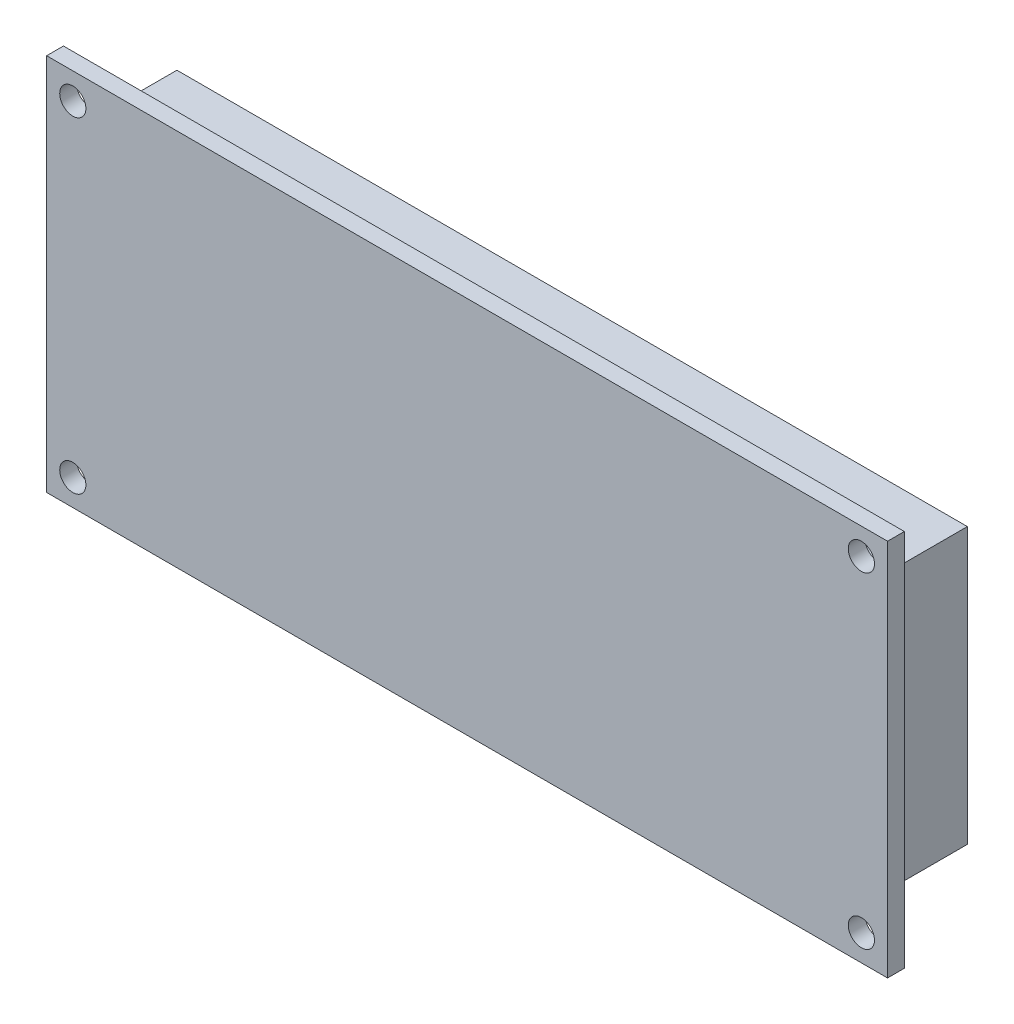
ISO-10303-21;
HEADER;
FILE_DESCRIPTION(('STEP AP214'),'2;1');
FILE_NAME('part.step','',(''),(''),'','','');
FILE_SCHEMA(('AUTOMOTIVE_DESIGN { 1 0 10303 214 1 1 1 1 }'));
ENDSEC;
DATA;
#1=APPLICATION_CONTEXT('core data for automotive mechanical design processes');
#2=APPLICATION_PROTOCOL_DEFINITION('international standard','automotive_design',2000,#1);
#3=PRODUCT_CONTEXT('',#1,'mechanical');
#4=PRODUCT('Part','Part','',(#3));
#5=PRODUCT_RELATED_PRODUCT_CATEGORY('part','',(#4));
#6=PRODUCT_DEFINITION_FORMATION('','',#4);
#7=PRODUCT_DEFINITION_CONTEXT('part definition',#1,'design');
#8=PRODUCT_DEFINITION('design','',#6,#7);
#9=PRODUCT_DEFINITION_SHAPE('','',#8);
#10=(LENGTH_UNIT() NAMED_UNIT(*) SI_UNIT(.MILLI.,.METRE.));
#11=(NAMED_UNIT(*) PLANE_ANGLE_UNIT() SI_UNIT($,.RADIAN.));
#12=(NAMED_UNIT(*) SI_UNIT($,.STERADIAN.) SOLID_ANGLE_UNIT());
#13=UNCERTAINTY_MEASURE_WITH_UNIT(LENGTH_MEASURE(1.E-05),#10,'distance_accuracy_value','');
#14=(GEOMETRIC_REPRESENTATION_CONTEXT(3) GLOBAL_UNCERTAINTY_ASSIGNED_CONTEXT((#13)) GLOBAL_UNIT_ASSIGNED_CONTEXT((#10,
#11,#12)) REPRESENTATION_CONTEXT('',''));
#15=CARTESIAN_POINT('',(0.,0.,0.));
#16=DIRECTION('',(0.,0.,1.));
#17=DIRECTION('',(1.,0.,0.));
#18=AXIS2_PLACEMENT_3D('',#15,#16,#17);
#19=CARTESIAN_POINT('',(0.,35.9918,0.));
#20=DIRECTION('',(0.,0.,-1.));
#21=DIRECTION('',(-1.,0.,0.));
#22=AXIS2_PLACEMENT_3D('',#19,#20,#21);
#23=PLANE('',#22);
#24=CARTESIAN_POINT('',(2.4892,2.4892,0.));
#25=DIRECTION('',(0.,0.,-1.));
#26=DIRECTION('',(-1.,0.,0.));
#27=AXIS2_PLACEMENT_3D('',#24,#25,#26);
#28=CIRCLE('',#27,1.2446);
#29=CARTESIAN_POINT('',(1.2446,2.4892,0.));
#30=VERTEX_POINT('',#29);
#31=EDGE_CURVE('E238',#30,#30,#28,.T.);
#32=ORIENTED_EDGE('',*,*,#31,.F.);
#33=EDGE_LOOP('',(#32));
#34=FACE_BOUND('',#33,.T.);
#35=CARTESIAN_POINT('',(2.4892,33.5026,0.));
#36=DIRECTION('',(0.,0.,-1.));
#37=DIRECTION('',(-1.,0.,0.));
#38=AXIS2_PLACEMENT_3D('',#35,#36,#37);
#39=CIRCLE('',#38,1.2446);
#40=CARTESIAN_POINT('',(1.2446,33.5026,0.));
#41=VERTEX_POINT('',#40);
#42=EDGE_CURVE('E229',#41,#41,#39,.T.);
#43=ORIENTED_EDGE('',*,*,#42,.F.);
#44=EDGE_LOOP('',(#43));
#45=FACE_BOUND('',#44,.T.);
#46=CARTESIAN_POINT('',(77.5208,33.5026,0.));
#47=DIRECTION('',(0.,0.,-1.));
#48=DIRECTION('',(-1.,0.,0.));
#49=AXIS2_PLACEMENT_3D('',#46,#47,#48);
#50=CIRCLE('',#49,1.2446);
#51=CARTESIAN_POINT('',(76.2762,33.5026,0.));
#52=VERTEX_POINT('',#51);
#53=EDGE_CURVE('E226',#52,#52,#50,.T.);
#54=ORIENTED_EDGE('',*,*,#53,.F.);
#55=EDGE_LOOP('',(#54));
#56=FACE_BOUND('',#55,.T.);
#57=CARTESIAN_POINT('',(77.5208,2.4892,0.));
#58=DIRECTION('',(0.,0.,-1.));
#59=DIRECTION('',(-1.,0.,0.));
#60=AXIS2_PLACEMENT_3D('',#57,#58,#59);
#61=CIRCLE('',#60,1.2446);
#62=CARTESIAN_POINT('',(76.2762,2.4892,0.));
#63=VERTEX_POINT('',#62);
#64=EDGE_CURVE('E149',#63,#63,#61,.T.);
#65=ORIENTED_EDGE('',*,*,#64,.F.);
#66=EDGE_LOOP('',(#65));
#67=FACE_BOUND('',#66,.T.);
#68=DIRECTION('',(0.,1.,0.));
#69=VECTOR('',#68,1.);
#70=CARTESIAN_POINT('',(0.,0.,0.));
#71=LINE('',#70,#69);
#72=CARTESIAN_POINT('',(0.,0.,0.));
#73=VERTEX_POINT('',#72);
#74=CARTESIAN_POINT('',(0.,35.9918,0.));
#75=VERTEX_POINT('',#74);
#76=EDGE_CURVE('E195',#73,#75,#71,.T.);
#77=ORIENTED_EDGE('',*,*,#76,.T.);
#78=DIRECTION('',(1.,0.,0.));
#79=VECTOR('',#78,1.);
#80=CARTESIAN_POINT('',(0.,35.9918,0.));
#81=LINE('',#80,#79);
#82=CARTESIAN_POINT('',(80.01,35.9918,0.));
#83=VERTEX_POINT('',#82);
#84=EDGE_CURVE('E210',#75,#83,#81,.T.);
#85=ORIENTED_EDGE('',*,*,#84,.T.);
#86=DIRECTION('',(0.,1.,0.));
#87=VECTOR('',#86,1.);
#88=CARTESIAN_POINT('',(80.01,0.,0.));
#89=LINE('',#88,#87);
#90=CARTESIAN_POINT('',(80.01,0.,0.));
#91=VERTEX_POINT('',#90);
#92=EDGE_CURVE('E213',#91,#83,#89,.T.);
#93=ORIENTED_EDGE('',*,*,#92,.F.);
#94=DIRECTION('',(1.,0.,0.));
#95=VECTOR('',#94,1.);
#96=CARTESIAN_POINT('',(0.,0.,0.));
#97=LINE('',#96,#95);
#98=EDGE_CURVE('E200',#73,#91,#97,.T.);
#99=ORIENTED_EDGE('',*,*,#98,.F.);
#100=EDGE_LOOP('',(#77,#85,#93,#99));
#101=FACE_BOUND('',#100,.T.);
#102=DIRECTION('',(1.,0.,0.));
#103=VECTOR('',#102,1.);
#104=CARTESIAN_POINT('',(2.4892,31.0896,0.));
#105=LINE('',#104,#103);
#106=CARTESIAN_POINT('',(2.4892,31.0896,0.));
#107=VERTEX_POINT('',#106);
#108=CARTESIAN_POINT('',(77.6986,31.0896,0.));
#109=VERTEX_POINT('',#108);
#110=EDGE_CURVE('E59',#107,#109,#105,.T.);
#111=ORIENTED_EDGE('',*,*,#110,.F.);
#112=DIRECTION('',(0.,1.,0.));
#113=VECTOR('',#112,1.);
#114=CARTESIAN_POINT('',(2.4892,4.9022,0.));
#115=LINE('',#114,#113);
#116=CARTESIAN_POINT('',(2.4892,4.9022,0.));
#117=VERTEX_POINT('',#116);
#118=EDGE_CURVE('E162',#117,#107,#115,.T.);
#119=ORIENTED_EDGE('',*,*,#118,.F.);
#120=DIRECTION('',(1.,0.,0.));
#121=VECTOR('',#120,1.);
#122=CARTESIAN_POINT('',(2.4892,4.9022,0.));
#123=LINE('',#122,#121);
#124=CARTESIAN_POINT('',(77.6986,4.9022,0.));
#125=VERTEX_POINT('',#124);
#126=EDGE_CURVE('E170',#117,#125,#123,.T.);
#127=ORIENTED_EDGE('',*,*,#126,.T.);
#128=DIRECTION('',(0.,1.,0.));
#129=VECTOR('',#128,1.);
#130=CARTESIAN_POINT('',(77.6986,4.9022,0.));
#131=LINE('',#130,#129);
#132=EDGE_CURVE('E182',#125,#109,#131,.T.);
#133=ORIENTED_EDGE('',*,*,#132,.T.);
#134=EDGE_LOOP('',(#111,#119,#127,#133));
#135=FACE_BOUND('',#134,.T.);
#136=ADVANCED_FACE('F34',(#34,#45,#56,#67,#101,#135),#23,.T.);
#137=CARTESIAN_POINT('',(0.,0.,1.6002));
#138=DIRECTION('',(-1.,0.,0.));
#139=DIRECTION('',(0.,0.,1.));
#140=AXIS2_PLACEMENT_3D('',#137,#138,#139);
#141=PLANE('',#140);
#142=ORIENTED_EDGE('',*,*,#76,.F.);
#143=DIRECTION('',(0.,0.,-1.));
#144=VECTOR('',#143,1.);
#145=CARTESIAN_POINT('',(0.,0.,1.6002));
#146=LINE('',#145,#144);
#147=CARTESIAN_POINT('',(0.,0.,1.6002));
#148=VERTEX_POINT('',#147);
#149=EDGE_CURVE('E11',#148,#73,#146,.T.);
#150=ORIENTED_EDGE('',*,*,#149,.F.);
#151=DIRECTION('',(0.,1.,0.));
#152=VECTOR('',#151,1.);
#153=CARTESIAN_POINT('',(0.,0.,1.6002));
#154=LINE('',#153,#152);
#155=CARTESIAN_POINT('',(0.,35.9918,1.6002));
#156=VERTEX_POINT('',#155);
#157=EDGE_CURVE('E196',#148,#156,#154,.T.);
#158=ORIENTED_EDGE('',*,*,#157,.T.);
#159=DIRECTION('',(0.,0.,-1.));
#160=VECTOR('',#159,1.);
#161=CARTESIAN_POINT('',(0.,35.9918,1.6002));
#162=LINE('',#161,#160);
#163=EDGE_CURVE('E207',#156,#75,#162,.T.);
#164=ORIENTED_EDGE('',*,*,#163,.T.);
#165=EDGE_LOOP('',(#142,#150,#158,#164));
#166=FACE_BOUND('',#165,.T.);
#167=ADVANCED_FACE('F36',(#166),#141,.T.);
#168=CARTESIAN_POINT('',(0.,0.,1.6002));
#169=DIRECTION('',(0.,1.,0.));
#170=DIRECTION('',(0.,0.,1.));
#171=AXIS2_PLACEMENT_3D('',#168,#169,#170);
#172=PLANE('',#171);
#173=ORIENTED_EDGE('',*,*,#98,.T.);
#174=DIRECTION('',(0.,0.,-1.));
#175=VECTOR('',#174,1.);
#176=CARTESIAN_POINT('',(80.01,0.,1.6002));
#177=LINE('',#176,#175);
#178=CARTESIAN_POINT('',(80.01,0.,1.6002));
#179=VERTEX_POINT('',#178);
#180=EDGE_CURVE('E43',#179,#91,#177,.T.);
#181=ORIENTED_EDGE('',*,*,#180,.F.);
#182=DIRECTION('',(1.,0.,0.));
#183=VECTOR('',#182,1.);
#184=CARTESIAN_POINT('',(0.,0.,1.6002));
#185=LINE('',#184,#183);
#186=EDGE_CURVE('E205',#148,#179,#185,.T.);
#187=ORIENTED_EDGE('',*,*,#186,.F.);
#188=ORIENTED_EDGE('',*,*,#149,.T.);
#189=EDGE_LOOP('',(#173,#181,#187,#188));
#190=FACE_BOUND('',#189,.T.);
#191=ADVANCED_FACE('F271',(#190),#172,.F.);
#192=CARTESIAN_POINT('',(80.01,0.,1.6002));
#193=DIRECTION('',(-1.,0.,0.));
#194=DIRECTION('',(0.,0.,1.));
#195=AXIS2_PLACEMENT_3D('',#192,#193,#194);
#196=PLANE('',#195);
#197=ORIENTED_EDGE('',*,*,#92,.T.);
#198=DIRECTION('',(0.,0.,-1.));
#199=VECTOR('',#198,1.);
#200=CARTESIAN_POINT('',(80.01,35.9918,1.6002));
#201=LINE('',#200,#199);
#202=CARTESIAN_POINT('',(80.01,35.9918,1.6002));
#203=VERTEX_POINT('',#202);
#204=EDGE_CURVE('E219',#203,#83,#201,.T.);
#205=ORIENTED_EDGE('',*,*,#204,.F.);
#206=DIRECTION('',(0.,1.,0.));
#207=VECTOR('',#206,1.);
#208=CARTESIAN_POINT('',(80.01,0.,1.6002));
#209=LINE('',#208,#207);
#210=EDGE_CURVE('E203',#179,#203,#209,.T.);
#211=ORIENTED_EDGE('',*,*,#210,.F.);
#212=ORIENTED_EDGE('',*,*,#180,.T.);
#213=EDGE_LOOP('',(#197,#205,#211,#212));
#214=FACE_BOUND('',#213,.T.);
#215=ADVANCED_FACE('F268',(#214),#196,.F.);
#216=CARTESIAN_POINT('',(0.,35.9918,1.6002));
#217=DIRECTION('',(0.,1.,0.));
#218=DIRECTION('',(0.,0.,1.));
#219=AXIS2_PLACEMENT_3D('',#216,#217,#218);
#220=PLANE('',#219);
#221=ORIENTED_EDGE('',*,*,#84,.F.);
#222=ORIENTED_EDGE('',*,*,#163,.F.);
#223=DIRECTION('',(1.,0.,0.));
#224=VECTOR('',#223,1.);
#225=CARTESIAN_POINT('',(0.,35.9918,1.6002));
#226=LINE('',#225,#224);
#227=EDGE_CURVE('E199',#156,#203,#226,.T.);
#228=ORIENTED_EDGE('',*,*,#227,.T.);
#229=ORIENTED_EDGE('',*,*,#204,.T.);
#230=EDGE_LOOP('',(#221,#222,#228,#229));
#231=FACE_BOUND('',#230,.T.);
#232=ADVANCED_FACE('F264',(#231),#220,.T.);
#233=CARTESIAN_POINT('',(0.,35.9918,1.6002));
#234=DIRECTION('',(0.,0.,-1.));
#235=DIRECTION('',(-1.,0.,0.));
#236=AXIS2_PLACEMENT_3D('',#233,#234,#235);
#237=PLANE('',#236);
#238=CARTESIAN_POINT('',(2.4892,2.4892,1.6002));
#239=DIRECTION('',(0.,0.,-1.));
#240=DIRECTION('',(-1.,0.,0.));
#241=AXIS2_PLACEMENT_3D('',#238,#239,#240);
#242=CIRCLE('',#241,1.2446);
#243=CARTESIAN_POINT('',(1.2446,2.4892,1.6002));
#244=VERTEX_POINT('',#243);
#245=EDGE_CURVE('E38',#244,#244,#242,.T.);
#246=ORIENTED_EDGE('',*,*,#245,.T.);
#247=EDGE_LOOP('',(#246));
#248=FACE_BOUND('',#247,.T.);
#249=CARTESIAN_POINT('',(2.4892,33.5026,1.6002));
#250=DIRECTION('',(0.,0.,-1.));
#251=DIRECTION('',(-1.,0.,0.));
#252=AXIS2_PLACEMENT_3D('',#249,#250,#251);
#253=CIRCLE('',#252,1.2446);
#254=CARTESIAN_POINT('',(1.2446,33.5026,1.6002));
#255=VERTEX_POINT('',#254);
#256=EDGE_CURVE('E227',#255,#255,#253,.T.);
#257=ORIENTED_EDGE('',*,*,#256,.T.);
#258=EDGE_LOOP('',(#257));
#259=FACE_BOUND('',#258,.T.);
#260=CARTESIAN_POINT('',(77.5208,33.5026,1.6002));
#261=DIRECTION('',(0.,0.,-1.));
#262=DIRECTION('',(-1.,0.,0.));
#263=AXIS2_PLACEMENT_3D('',#260,#261,#262);
#264=CIRCLE('',#263,1.2446);
#265=CARTESIAN_POINT('',(76.2762,33.5026,1.6002));
#266=VERTEX_POINT('',#265);
#267=EDGE_CURVE('E224',#266,#266,#264,.T.);
#268=ORIENTED_EDGE('',*,*,#267,.T.);
#269=EDGE_LOOP('',(#268));
#270=FACE_BOUND('',#269,.T.);
#271=CARTESIAN_POINT('',(77.5208,2.4892,1.6002));
#272=DIRECTION('',(0.,0.,-1.));
#273=DIRECTION('',(-1.,0.,0.));
#274=AXIS2_PLACEMENT_3D('',#271,#272,#273);
#275=CIRCLE('',#274,1.2446);
#276=CARTESIAN_POINT('',(76.2762,2.4892,1.6002));
#277=VERTEX_POINT('',#276);
#278=EDGE_CURVE('E156',#277,#277,#275,.T.);
#279=ORIENTED_EDGE('',*,*,#278,.T.);
#280=EDGE_LOOP('',(#279));
#281=FACE_BOUND('',#280,.T.);
#282=ORIENTED_EDGE('',*,*,#157,.F.);
#283=ORIENTED_EDGE('',*,*,#186,.T.);
#284=ORIENTED_EDGE('',*,*,#210,.T.);
#285=ORIENTED_EDGE('',*,*,#227,.F.);
#286=EDGE_LOOP('',(#282,#283,#284,#285));
#287=FACE_BOUND('',#286,.T.);
#288=ADVANCED_FACE('F273',(#248,#259,#270,#281,#287),#237,.F.);
#289=CARTESIAN_POINT('',(2.4892,4.9022,-8.3058));
#290=DIRECTION('',(1.,0.,0.));
#291=DIRECTION('',(0.,1.,0.));
#292=AXIS2_PLACEMENT_3D('',#289,#290,#291);
#293=PLANE('',#292);
#294=ORIENTED_EDGE('',*,*,#118,.T.);
#295=DIRECTION('',(0.,0.,1.));
#296=VECTOR('',#295,1.);
#297=CARTESIAN_POINT('',(2.4892,31.0896,-8.3058));
#298=LINE('',#297,#296);
#299=CARTESIAN_POINT('',(2.4892,31.0896,-8.3058));
#300=VERTEX_POINT('',#299);
#301=EDGE_CURVE('E193',#300,#107,#298,.T.);
#302=ORIENTED_EDGE('',*,*,#301,.F.);
#303=DIRECTION('',(0.,1.,0.));
#304=VECTOR('',#303,1.);
#305=CARTESIAN_POINT('',(2.4892,4.9022,-8.3058));
#306=LINE('',#305,#304);
#307=CARTESIAN_POINT('',(2.4892,4.9022,-8.3058));
#308=VERTEX_POINT('',#307);
#309=EDGE_CURVE('E166',#308,#300,#306,.T.);
#310=ORIENTED_EDGE('',*,*,#309,.F.);
#311=DIRECTION('',(0.,0.,1.));
#312=VECTOR('',#311,1.);
#313=CARTESIAN_POINT('',(2.4892,4.9022,-8.3058));
#314=LINE('',#313,#312);
#315=EDGE_CURVE('E178',#308,#117,#314,.T.);
#316=ORIENTED_EDGE('',*,*,#315,.T.);
#317=EDGE_LOOP('',(#294,#302,#310,#316));
#318=FACE_BOUND('',#317,.T.);
#319=ADVANCED_FACE('F275',(#318),#293,.F.);
#320=CARTESIAN_POINT('',(2.4892,31.0896,-8.3058));
#321=DIRECTION('',(0.,-1.,0.));
#322=DIRECTION('',(0.,0.,-1.));
#323=AXIS2_PLACEMENT_3D('',#320,#321,#322);
#324=PLANE('',#323);
#325=ORIENTED_EDGE('',*,*,#110,.T.);
#326=DIRECTION('',(0.,0.,1.));
#327=VECTOR('',#326,1.);
#328=CARTESIAN_POINT('',(77.6986,31.0896,-8.3058));
#329=LINE('',#328,#327);
#330=CARTESIAN_POINT('',(77.6986,31.0896,-8.3058));
#331=VERTEX_POINT('',#330);
#332=EDGE_CURVE('E190',#331,#109,#329,.T.);
#333=ORIENTED_EDGE('',*,*,#332,.F.);
#334=DIRECTION('',(1.,0.,0.));
#335=VECTOR('',#334,1.);
#336=CARTESIAN_POINT('',(2.4892,31.0896,-8.3058));
#337=LINE('',#336,#335);
#338=EDGE_CURVE('E169',#300,#331,#337,.T.);
#339=ORIENTED_EDGE('',*,*,#338,.F.);
#340=ORIENTED_EDGE('',*,*,#301,.T.);
#341=EDGE_LOOP('',(#325,#333,#339,#340));
#342=FACE_BOUND('',#341,.T.);
#343=ADVANCED_FACE('F282',(#342),#324,.F.);
#344=CARTESIAN_POINT('',(77.6986,4.9022,-8.3058));
#345=DIRECTION('',(1.,0.,0.));
#346=DIRECTION('',(0.,0.,-1.));
#347=AXIS2_PLACEMENT_3D('',#344,#345,#346);
#348=PLANE('',#347);
#349=ORIENTED_EDGE('',*,*,#132,.F.);
#350=DIRECTION('',(0.,0.,1.));
#351=VECTOR('',#350,1.);
#352=CARTESIAN_POINT('',(77.6986,4.9022,-8.3058));
#353=LINE('',#352,#351);
#354=CARTESIAN_POINT('',(77.6986,4.9022,-8.3058));
#355=VERTEX_POINT('',#354);
#356=EDGE_CURVE('E187',#355,#125,#353,.T.);
#357=ORIENTED_EDGE('',*,*,#356,.F.);
#358=DIRECTION('',(0.,1.,0.));
#359=VECTOR('',#358,1.);
#360=CARTESIAN_POINT('',(77.6986,4.9022,-8.3058));
#361=LINE('',#360,#359);
#362=EDGE_CURVE('E172',#355,#331,#361,.T.);
#363=ORIENTED_EDGE('',*,*,#362,.T.);
#364=ORIENTED_EDGE('',*,*,#332,.T.);
#365=EDGE_LOOP('',(#349,#357,#363,#364));
#366=FACE_BOUND('',#365,.T.);
#367=ADVANCED_FACE('F316',(#366),#348,.T.);
#368=CARTESIAN_POINT('',(2.4892,4.9022,-8.3058));
#369=DIRECTION('',(0.,-1.,0.));
#370=DIRECTION('',(0.,0.,-1.));
#371=AXIS2_PLACEMENT_3D('',#368,#369,#370);
#372=PLANE('',#371);
#373=ORIENTED_EDGE('',*,*,#126,.F.);
#374=ORIENTED_EDGE('',*,*,#315,.F.);
#375=DIRECTION('',(1.,0.,0.));
#376=VECTOR('',#375,1.);
#377=CARTESIAN_POINT('',(2.4892,4.9022,-8.3058));
#378=LINE('',#377,#376);
#379=EDGE_CURVE('E175',#308,#355,#378,.T.);
#380=ORIENTED_EDGE('',*,*,#379,.T.);
#381=ORIENTED_EDGE('',*,*,#356,.T.);
#382=EDGE_LOOP('',(#373,#374,#380,#381));
#383=FACE_BOUND('',#382,.T.);
#384=ADVANCED_FACE('F325',(#383),#372,.T.);
#385=CARTESIAN_POINT('',(2.4892,31.0896,-8.3058));
#386=DIRECTION('',(0.,0.,-1.));
#387=DIRECTION('',(-1.,0.,0.));
#388=AXIS2_PLACEMENT_3D('',#385,#386,#387);
#389=PLANE('',#388);
#390=DIRECTION('',(0.,1.,0.));
#391=VECTOR('',#390,1.);
#392=CARTESIAN_POINT('',(8.0899,10.9982,-8.3058));
#393=LINE('',#392,#391);
#394=CARTESIAN_POINT('',(8.0899,10.9982,-8.3058));
#395=VERTEX_POINT('',#394);
#396=CARTESIAN_POINT('',(8.0899,24.9936,-8.3058));
#397=VERTEX_POINT('',#396);
#398=EDGE_CURVE('E51',#395,#397,#393,.T.);
#399=ORIENTED_EDGE('',*,*,#398,.F.);
#400=DIRECTION('',(1.,0.,0.));
#401=VECTOR('',#400,1.);
#402=CARTESIAN_POINT('',(8.0899,10.9982,-8.3058));
#403=LINE('',#402,#401);
#404=CARTESIAN_POINT('',(72.0979,10.9982,-8.3058));
#405=VERTEX_POINT('',#404);
#406=EDGE_CURVE('E143',#395,#405,#403,.T.);
#407=ORIENTED_EDGE('',*,*,#406,.T.);
#408=DIRECTION('',(0.,1.,0.));
#409=VECTOR('',#408,1.);
#410=CARTESIAN_POINT('',(72.0979,10.9982,-8.3058));
#411=LINE('',#410,#409);
#412=CARTESIAN_POINT('',(72.0979,24.9936,-8.3058));
#413=VERTEX_POINT('',#412);
#414=EDGE_CURVE('E146',#405,#413,#411,.T.);
#415=ORIENTED_EDGE('',*,*,#414,.T.);
#416=DIRECTION('',(1.,0.,0.));
#417=VECTOR('',#416,1.);
#418=CARTESIAN_POINT('',(8.0899,24.9936,-8.3058));
#419=LINE('',#418,#417);
#420=EDGE_CURVE('E155',#397,#413,#419,.T.);
#421=ORIENTED_EDGE('',*,*,#420,.F.);
#422=EDGE_LOOP('',(#399,#407,#415,#421));
#423=FACE_BOUND('',#422,.T.);
#424=ORIENTED_EDGE('',*,*,#309,.T.);
#425=ORIENTED_EDGE('',*,*,#338,.T.);
#426=ORIENTED_EDGE('',*,*,#362,.F.);
#427=ORIENTED_EDGE('',*,*,#379,.F.);
#428=EDGE_LOOP('',(#424,#425,#426,#427));
#429=FACE_BOUND('',#428,.T.);
#430=ADVANCED_FACE('F335',(#423,#429),#389,.T.);
#431=CARTESIAN_POINT('',(8.0899,10.9982,-8.0518));
#432=DIRECTION('',(-1.,0.,0.));
#433=DIRECTION('',(0.,0.,1.));
#434=AXIS2_PLACEMENT_3D('',#431,#432,#433);
#435=PLANE('',#434);
#436=ORIENTED_EDGE('',*,*,#398,.T.);
#437=DIRECTION('',(0.,0.,-1.));
#438=VECTOR('',#437,1.);
#439=CARTESIAN_POINT('',(8.0899,24.9936,-8.0518));
#440=LINE('',#439,#438);
#441=CARTESIAN_POINT('',(8.0899,24.9936,-8.0518));
#442=VERTEX_POINT('',#441);
#443=EDGE_CURVE('E122',#442,#397,#440,.T.);
#444=ORIENTED_EDGE('',*,*,#443,.F.);
#445=DIRECTION('',(0.,1.,0.));
#446=VECTOR('',#445,1.);
#447=CARTESIAN_POINT('',(8.0899,10.9982,-8.0518));
#448=LINE('',#447,#446);
#449=CARTESIAN_POINT('',(8.0899,10.9982,-8.0518));
#450=VERTEX_POINT('',#449);
#451=EDGE_CURVE('E126',#450,#442,#448,.T.);
#452=ORIENTED_EDGE('',*,*,#451,.F.);
#453=DIRECTION('',(0.,0.,-1.));
#454=VECTOR('',#453,1.);
#455=CARTESIAN_POINT('',(8.0899,10.9982,-8.0518));
#456=LINE('',#455,#454);
#457=EDGE_CURVE('E160',#450,#395,#456,.T.);
#458=ORIENTED_EDGE('',*,*,#457,.T.);
#459=EDGE_LOOP('',(#436,#444,#452,#458));
#460=FACE_BOUND('',#459,.T.);
#461=ADVANCED_FACE('F124',(#460),#435,.F.);
#462=CARTESIAN_POINT('',(8.0899,10.9982,-8.0518));
#463=DIRECTION('',(0.,1.,0.));
#464=DIRECTION('',(-1.,0.,0.));
#465=AXIS2_PLACEMENT_3D('',#462,#463,#464);
#466=PLANE('',#465);
#467=ORIENTED_EDGE('',*,*,#406,.F.);
#468=ORIENTED_EDGE('',*,*,#457,.F.);
#469=DIRECTION('',(1.,0.,0.));
#470=VECTOR('',#469,1.);
#471=CARTESIAN_POINT('',(8.0899,10.9982,-8.0518));
#472=LINE('',#471,#470);
#473=CARTESIAN_POINT('',(72.0979,10.9982,-8.0518));
#474=VERTEX_POINT('',#473);
#475=EDGE_CURVE('E131',#450,#474,#472,.T.);
#476=ORIENTED_EDGE('',*,*,#475,.T.);
#477=DIRECTION('',(0.,0.,-1.));
#478=VECTOR('',#477,1.);
#479=CARTESIAN_POINT('',(72.0979,10.9982,-8.0518));
#480=LINE('',#479,#478);
#481=EDGE_CURVE('E163',#474,#405,#480,.T.);
#482=ORIENTED_EDGE('',*,*,#481,.T.);
#483=EDGE_LOOP('',(#467,#468,#476,#482));
#484=FACE_BOUND('',#483,.T.);
#485=ADVANCED_FACE('F354',(#484),#466,.T.);
#486=CARTESIAN_POINT('',(72.0979,10.9982,-8.0518));
#487=DIRECTION('',(-1.,0.,0.));
#488=DIRECTION('',(0.,0.,1.));
#489=AXIS2_PLACEMENT_3D('',#486,#487,#488);
#490=PLANE('',#489);
#491=ORIENTED_EDGE('',*,*,#414,.F.);
#492=ORIENTED_EDGE('',*,*,#481,.F.);
#493=DIRECTION('',(0.,1.,0.));
#494=VECTOR('',#493,1.);
#495=CARTESIAN_POINT('',(72.0979,10.9982,-8.0518));
#496=LINE('',#495,#494);
#497=CARTESIAN_POINT('',(72.0979,24.9936,-8.0518));
#498=VERTEX_POINT('',#497);
#499=EDGE_CURVE('E139',#474,#498,#496,.T.);
#500=ORIENTED_EDGE('',*,*,#499,.T.);
#501=DIRECTION('',(0.,0.,-1.));
#502=VECTOR('',#501,1.);
#503=CARTESIAN_POINT('',(72.0979,24.9936,-8.0518));
#504=LINE('',#503,#502);
#505=EDGE_CURVE('E130',#498,#413,#504,.T.);
#506=ORIENTED_EDGE('',*,*,#505,.T.);
#507=EDGE_LOOP('',(#491,#492,#500,#506));
#508=FACE_BOUND('',#507,.T.);
#509=ADVANCED_FACE('F363',(#508),#490,.T.);
#510=CARTESIAN_POINT('',(8.0899,24.9936,-8.0518));
#511=DIRECTION('',(0.,1.,0.));
#512=DIRECTION('',(-1.,0.,0.));
#513=AXIS2_PLACEMENT_3D('',#510,#511,#512);
#514=PLANE('',#513);
#515=ORIENTED_EDGE('',*,*,#420,.T.);
#516=ORIENTED_EDGE('',*,*,#505,.F.);
#517=DIRECTION('',(1.,0.,0.));
#518=VECTOR('',#517,1.);
#519=CARTESIAN_POINT('',(8.0899,24.9936,-8.0518));
#520=LINE('',#519,#518);
#521=EDGE_CURVE('E135',#442,#498,#520,.T.);
#522=ORIENTED_EDGE('',*,*,#521,.F.);
#523=ORIENTED_EDGE('',*,*,#443,.T.);
#524=EDGE_LOOP('',(#515,#516,#522,#523));
#525=FACE_BOUND('',#524,.T.);
#526=ADVANCED_FACE('F136',(#525),#514,.F.);
#527=CARTESIAN_POINT('',(8.0899,24.9936,-8.0518));
#528=DIRECTION('',(0.,0.,-1.));
#529=DIRECTION('',(-1.,0.,0.));
#530=AXIS2_PLACEMENT_3D('',#527,#528,#529);
#531=PLANE('',#530);
#532=ORIENTED_EDGE('',*,*,#451,.T.);
#533=ORIENTED_EDGE('',*,*,#521,.T.);
#534=ORIENTED_EDGE('',*,*,#499,.F.);
#535=ORIENTED_EDGE('',*,*,#475,.F.);
#536=EDGE_LOOP('',(#532,#533,#534,#535));
#537=FACE_BOUND('',#536,.T.);
#538=ADVANCED_FACE('F142',(#537),#531,.T.);
#539=CARTESIAN_POINT('',(77.5208,2.4892,2.54));
#540=DIRECTION('',(0.,0.,-1.));
#541=DIRECTION('',(-1.,0.,0.));
#542=AXIS2_PLACEMENT_3D('',#539,#540,#541);
#543=CYLINDRICAL_SURFACE('',#542,1.2446);
#544=ORIENTED_EDGE('',*,*,#64,.T.);
#545=EDGE_LOOP('',(#544));
#546=FACE_BOUND('',#545,.T.);
#547=ORIENTED_EDGE('',*,*,#278,.F.);
#548=EDGE_LOOP('',(#547));
#549=FACE_BOUND('',#548,.T.);
#550=ADVANCED_FACE('F390',(#546,#549),#543,.F.);
#551=CARTESIAN_POINT('',(77.5208,33.5026,2.54));
#552=DIRECTION('',(0.,0.,-1.));
#553=DIRECTION('',(-1.,0.,0.));
#554=AXIS2_PLACEMENT_3D('',#551,#552,#553);
#555=CYLINDRICAL_SURFACE('',#554,1.2446);
#556=ORIENTED_EDGE('',*,*,#53,.T.);
#557=EDGE_LOOP('',(#556));
#558=FACE_BOUND('',#557,.T.);
#559=ORIENTED_EDGE('',*,*,#267,.F.);
#560=EDGE_LOOP('',(#559));
#561=FACE_BOUND('',#560,.T.);
#562=ADVANCED_FACE('F407',(#558,#561),#555,.F.);
#563=CARTESIAN_POINT('',(2.4892,33.5026,2.54));
#564=DIRECTION('',(0.,0.,-1.));
#565=DIRECTION('',(-1.,0.,0.));
#566=AXIS2_PLACEMENT_3D('',#563,#564,#565);
#567=CYLINDRICAL_SURFACE('',#566,1.2446);
#568=ORIENTED_EDGE('',*,*,#42,.T.);
#569=EDGE_LOOP('',(#568));
#570=FACE_BOUND('',#569,.T.);
#571=ORIENTED_EDGE('',*,*,#256,.F.);
#572=EDGE_LOOP('',(#571));
#573=FACE_BOUND('',#572,.T.);
#574=ADVANCED_FACE('F417',(#570,#573),#567,.F.);
#575=CARTESIAN_POINT('',(2.4892,2.4892,2.54));
#576=DIRECTION('',(0.,0.,-1.));
#577=DIRECTION('',(-1.,0.,0.));
#578=AXIS2_PLACEMENT_3D('',#575,#576,#577);
#579=CYLINDRICAL_SURFACE('',#578,1.2446);
#580=ORIENTED_EDGE('',*,*,#31,.T.);
#581=EDGE_LOOP('',(#580));
#582=FACE_BOUND('',#581,.T.);
#583=ORIENTED_EDGE('',*,*,#245,.F.);
#584=EDGE_LOOP('',(#583));
#585=FACE_BOUND('',#584,.T.);
#586=ADVANCED_FACE('F243',(#582,#585),#579,.F.);
#587=CLOSED_SHELL('',(#136,#167,#191,#215,#232,#288,#319,#343,#367,#384,#430,#461,#485,#509,
#526,#538,#550,#562,#574,#586));
#588=MANIFOLD_SOLID_BREP('B2',#587);
#589=ADVANCED_BREP_SHAPE_REPRESENTATION('',(#18,#588),#14);
#590=SHAPE_DEFINITION_REPRESENTATION(#9,#589);
ENDSEC;
END-ISO-10303-21;
